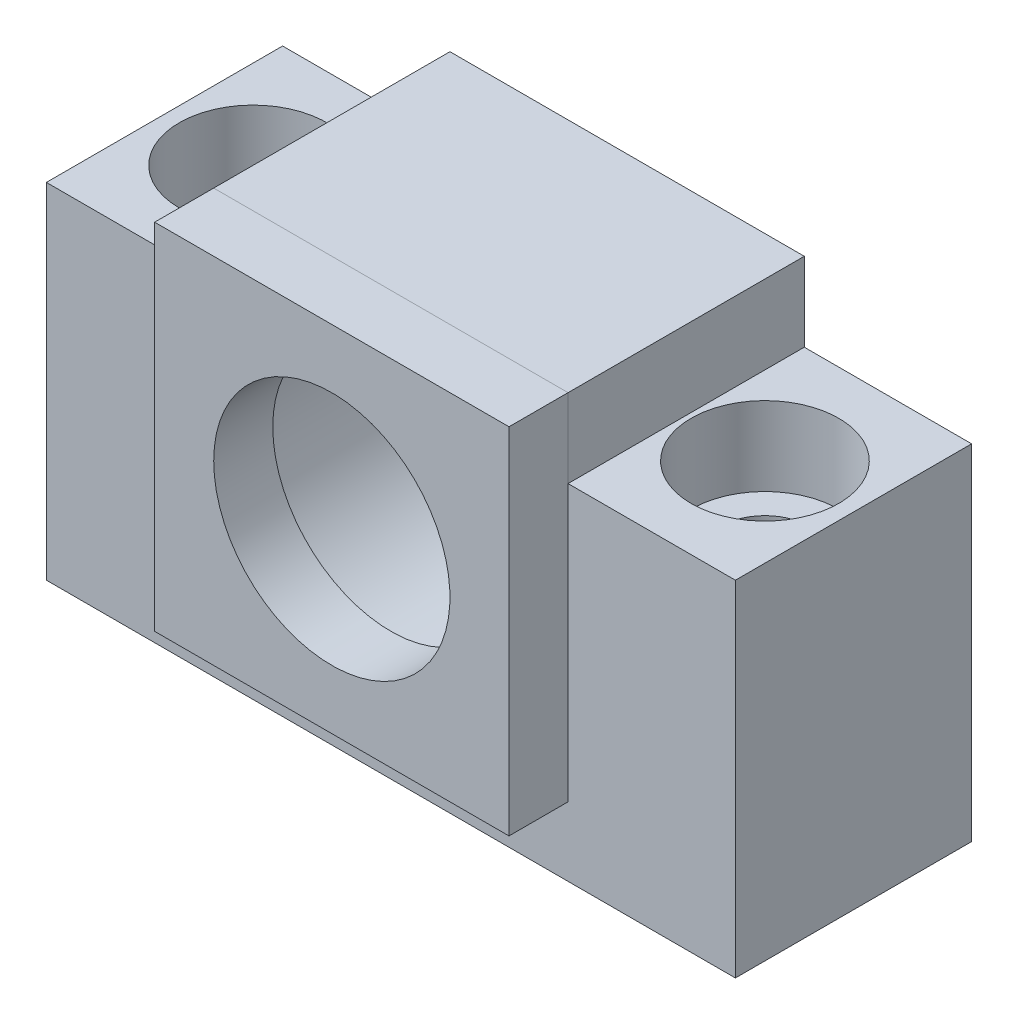
ISO-10303-21;
HEADER;
FILE_DESCRIPTION(('STEP AP214'),'2;1');
FILE_NAME('part.step','',(''),(''),'','','');
FILE_SCHEMA(('AUTOMOTIVE_DESIGN { 1 0 10303 214 1 1 1 1 }'));
ENDSEC;
DATA;
#1=APPLICATION_CONTEXT('core data for automotive mechanical design processes');
#2=APPLICATION_PROTOCOL_DEFINITION('international standard','automotive_design',2000,#1);
#3=PRODUCT_CONTEXT('',#1,'mechanical');
#4=PRODUCT('Part','Part','',(#3));
#5=PRODUCT_RELATED_PRODUCT_CATEGORY('part','',(#4));
#6=PRODUCT_DEFINITION_FORMATION('','',#4);
#7=PRODUCT_DEFINITION_CONTEXT('part definition',#1,'design');
#8=PRODUCT_DEFINITION('design','',#6,#7);
#9=PRODUCT_DEFINITION_SHAPE('','',#8);
#10=(LENGTH_UNIT() NAMED_UNIT(*) SI_UNIT(.MILLI.,.METRE.));
#11=(NAMED_UNIT(*) PLANE_ANGLE_UNIT() SI_UNIT($,.RADIAN.));
#12=(NAMED_UNIT(*) SI_UNIT($,.STERADIAN.) SOLID_ANGLE_UNIT());
#13=UNCERTAINTY_MEASURE_WITH_UNIT(LENGTH_MEASURE(1.E-05),#10,'distance_accuracy_value','');
#14=(GEOMETRIC_REPRESENTATION_CONTEXT(3) GLOBAL_UNCERTAINTY_ASSIGNED_CONTEXT((#13)) GLOBAL_UNIT_ASSIGNED_CONTEXT((#10,
#11,#12)) REPRESENTATION_CONTEXT('',''));
#15=CARTESIAN_POINT('',(0.,0.,0.));
#16=DIRECTION('',(0.,0.,1.));
#17=DIRECTION('',(1.,0.,0.));
#18=AXIS2_PLACEMENT_3D('',#15,#16,#17);
#19=CARTESIAN_POINT('',(17.,43.,30.));
#20=DIRECTION('',(1.,0.,0.));
#21=DIRECTION('',(0.,1.,0.));
#22=AXIS2_PLACEMENT_3D('',#19,#20,#21);
#23=PLANE('',#22);
#24=DIRECTION('',(0.,-1.,0.));
#25=VECTOR('',#24,1.);
#26=CARTESIAN_POINT('',(17.,43.,24.));
#27=LINE('',#26,#25);
#28=CARTESIAN_POINT('',(17.,43.,24.));
#29=VERTEX_POINT('',#28);
#30=CARTESIAN_POINT('',(17.,7.,24.));
#31=VERTEX_POINT('',#30);
#32=EDGE_CURVE('E106',#29,#31,#27,.T.);
#33=ORIENTED_EDGE('',*,*,#32,.T.);
#34=DIRECTION('',(0.,0.,-1.));
#35=VECTOR('',#34,1.);
#36=CARTESIAN_POINT('',(17.,7.,30.));
#37=LINE('',#36,#35);
#38=CARTESIAN_POINT('',(17.,7.,30.));
#39=VERTEX_POINT('',#38);
#40=EDGE_CURVE('E12',#39,#31,#37,.T.);
#41=ORIENTED_EDGE('',*,*,#40,.F.);
#42=DIRECTION('',(0.,-1.,0.));
#43=VECTOR('',#42,1.);
#44=CARTESIAN_POINT('',(17.,43.,30.));
#45=LINE('',#44,#43);
#46=CARTESIAN_POINT('',(17.,43.,30.));
#47=VERTEX_POINT('',#46);
#48=EDGE_CURVE('E94',#47,#39,#45,.T.);
#49=ORIENTED_EDGE('',*,*,#48,.F.);
#50=DIRECTION('',(0.,0.,-1.));
#51=VECTOR('',#50,1.);
#52=CARTESIAN_POINT('',(17.,43.,30.));
#53=LINE('',#52,#51);
#54=EDGE_CURVE('E102',#47,#29,#53,.T.);
#55=ORIENTED_EDGE('',*,*,#54,.T.);
#56=EDGE_LOOP('',(#33,#41,#49,#55));
#57=FACE_BOUND('',#56,.T.);
#58=ADVANCED_FACE('F43',(#57),#23,.F.);
#59=CARTESIAN_POINT('',(17.,7.,30.));
#60=DIRECTION('',(0.,1.,0.));
#61=DIRECTION('',(0.,0.,1.));
#62=AXIS2_PLACEMENT_3D('',#59,#60,#61);
#63=PLANE('',#62);
#64=DIRECTION('',(1.,0.,0.));
#65=VECTOR('',#64,1.);
#66=CARTESIAN_POINT('',(17.,7.,24.));
#67=LINE('',#66,#65);
#68=CARTESIAN_POINT('',(53.,7.,24.));
#69=VERTEX_POINT('',#68);
#70=EDGE_CURVE('E98',#31,#69,#67,.T.);
#71=ORIENTED_EDGE('',*,*,#70,.T.);
#72=DIRECTION('',(0.,0.,-1.));
#73=VECTOR('',#72,1.);
#74=CARTESIAN_POINT('',(53.,7.,30.));
#75=LINE('',#74,#73);
#76=CARTESIAN_POINT('',(53.,7.,30.));
#77=VERTEX_POINT('',#76);
#78=EDGE_CURVE('E51',#77,#69,#75,.T.);
#79=ORIENTED_EDGE('',*,*,#78,.F.);
#80=DIRECTION('',(1.,0.,0.));
#81=VECTOR('',#80,1.);
#82=CARTESIAN_POINT('',(17.,7.,30.));
#83=LINE('',#82,#81);
#84=EDGE_CURVE('E89',#39,#77,#83,.T.);
#85=ORIENTED_EDGE('',*,*,#84,.F.);
#86=ORIENTED_EDGE('',*,*,#40,.T.);
#87=EDGE_LOOP('',(#71,#79,#85,#86));
#88=FACE_BOUND('',#87,.T.);
#89=ADVANCED_FACE('F97',(#88),#63,.F.);
#90=CARTESIAN_POINT('',(53.,43.,30.));
#91=DIRECTION('',(-1.,0.,0.));
#92=DIRECTION('',(0.,0.,1.));
#93=AXIS2_PLACEMENT_3D('',#90,#91,#92);
#94=PLANE('',#93);
#95=DIRECTION('',(0.,1.,0.));
#96=VECTOR('',#95,1.);
#97=CARTESIAN_POINT('',(53.,43.,24.));
#98=LINE('',#97,#96);
#99=CARTESIAN_POINT('',(53.,43.,24.));
#100=VERTEX_POINT('',#99);
#101=EDGE_CURVE('E76',#69,#100,#98,.T.);
#102=ORIENTED_EDGE('',*,*,#101,.T.);
#103=DIRECTION('',(0.,0.,-1.));
#104=VECTOR('',#103,1.);
#105=CARTESIAN_POINT('',(53.,43.,30.));
#106=LINE('',#105,#104);
#107=CARTESIAN_POINT('',(53.,43.,30.));
#108=VERTEX_POINT('',#107);
#109=EDGE_CURVE('E99',#108,#100,#106,.T.);
#110=ORIENTED_EDGE('',*,*,#109,.F.);
#111=DIRECTION('',(0.,1.,0.));
#112=VECTOR('',#111,1.);
#113=CARTESIAN_POINT('',(53.,43.,30.));
#114=LINE('',#113,#112);
#115=EDGE_CURVE('E92',#77,#108,#114,.T.);
#116=ORIENTED_EDGE('',*,*,#115,.F.);
#117=ORIENTED_EDGE('',*,*,#78,.T.);
#118=EDGE_LOOP('',(#102,#110,#116,#117));
#119=FACE_BOUND('',#118,.T.);
#120=ADVANCED_FACE('F100',(#119),#94,.F.);
#121=CARTESIAN_POINT('',(17.,43.,30.));
#122=DIRECTION('',(0.,-1.,0.));
#123=DIRECTION('',(0.,0.,-1.));
#124=AXIS2_PLACEMENT_3D('',#121,#122,#123);
#125=PLANE('',#124);
#126=DIRECTION('',(-1.,0.,0.));
#127=VECTOR('',#126,1.);
#128=CARTESIAN_POINT('',(17.,43.,24.));
#129=LINE('',#128,#127);
#130=EDGE_CURVE('E82',#100,#29,#129,.T.);
#131=ORIENTED_EDGE('',*,*,#130,.T.);
#132=ORIENTED_EDGE('',*,*,#54,.F.);
#133=DIRECTION('',(-1.,0.,0.));
#134=VECTOR('',#133,1.);
#135=CARTESIAN_POINT('',(17.,43.,30.));
#136=LINE('',#135,#134);
#137=EDGE_CURVE('E59',#108,#47,#136,.T.);
#138=ORIENTED_EDGE('',*,*,#137,.F.);
#139=ORIENTED_EDGE('',*,*,#109,.T.);
#140=EDGE_LOOP('',(#131,#132,#138,#139));
#141=FACE_BOUND('',#140,.T.);
#142=ADVANCED_FACE('F114',(#141),#125,.F.);
#143=CARTESIAN_POINT('',(17.,7.,30.));
#144=DIRECTION('',(0.,0.,1.));
#145=DIRECTION('',(1.,0.,0.));
#146=AXIS2_PLACEMENT_3D('',#143,#144,#145);
#147=PLANE('',#146);
#148=CARTESIAN_POINT('',(35.,25.,30.));
#149=DIRECTION('',(0.,0.,-1.));
#150=DIRECTION('',(-1.,0.,0.));
#151=AXIS2_PLACEMENT_3D('',#148,#149,#150);
#152=CIRCLE('',#151,12.);
#153=CARTESIAN_POINT('',(23.,25.,30.));
#154=VERTEX_POINT('',#153);
#155=EDGE_CURVE('E109',#154,#154,#152,.T.);
#156=ORIENTED_EDGE('',*,*,#155,.T.);
#157=EDGE_LOOP('',(#156));
#158=FACE_BOUND('',#157,.T.);
#159=ORIENTED_EDGE('',*,*,#48,.T.);
#160=ORIENTED_EDGE('',*,*,#84,.T.);
#161=ORIENTED_EDGE('',*,*,#115,.T.);
#162=ORIENTED_EDGE('',*,*,#137,.T.);
#163=EDGE_LOOP('',(#159,#160,#161,#162));
#164=FACE_BOUND('',#163,.T.);
#165=ADVANCED_FACE('F90',(#158,#164),#147,.T.);
#166=CARTESIAN_POINT('',(17.,7.,24.));
#167=DIRECTION('',(0.,0.,1.));
#168=DIRECTION('',(1.,0.,0.));
#169=AXIS2_PLACEMENT_3D('',#166,#167,#168);
#170=PLANE('',#169);
#171=CARTESIAN_POINT('',(35.,25.,24.));
#172=DIRECTION('',(0.,0.,-1.));
#173=DIRECTION('',(-1.,0.,0.));
#174=AXIS2_PLACEMENT_3D('',#171,#172,#173);
#175=CIRCLE('',#174,12.);
#176=CARTESIAN_POINT('',(23.,25.,24.));
#177=VERTEX_POINT('',#176);
#178=EDGE_CURVE('E120',#177,#177,#175,.T.);
#179=ORIENTED_EDGE('',*,*,#178,.F.);
#180=EDGE_LOOP('',(#179));
#181=FACE_BOUND('',#180,.T.);
#182=ORIENTED_EDGE('',*,*,#32,.F.);
#183=ORIENTED_EDGE('',*,*,#130,.F.);
#184=ORIENTED_EDGE('',*,*,#101,.F.);
#185=ORIENTED_EDGE('',*,*,#70,.F.);
#186=EDGE_LOOP('',(#182,#183,#184,#185));
#187=FACE_BOUND('',#186,.T.);
#188=ADVANCED_FACE('F117',(#181,#187),#170,.F.);
#189=CARTESIAN_POINT('',(35.,25.,30.));
#190=DIRECTION('',(0.,0.,-1.));
#191=DIRECTION('',(-1.,0.,0.));
#192=AXIS2_PLACEMENT_3D('',#189,#190,#191);
#193=CYLINDRICAL_SURFACE('',#192,12.);
#194=ORIENTED_EDGE('',*,*,#155,.F.);
#195=EDGE_LOOP('',(#194));
#196=FACE_BOUND('',#195,.T.);
#197=ORIENTED_EDGE('',*,*,#178,.T.);
#198=EDGE_LOOP('',(#197));
#199=FACE_BOUND('',#198,.T.);
#200=ADVANCED_FACE('F127',(#196,#199),#193,.F.);
#201=CLOSED_SHELL('',(#58,#89,#120,#142,#165,#188,#200));
#202=MANIFOLD_SOLID_BREP('B2',#201);
#203=CARTESIAN_POINT('',(0.,0.,24.));
#204=DIRECTION('',(1.,0.,0.));
#205=DIRECTION('',(0.,0.,-1.));
#206=AXIS2_PLACEMENT_3D('',#203,#204,#205);
#207=PLANE('',#206);
#208=DIRECTION('',(0.,-1.,0.));
#209=VECTOR('',#208,1.);
#210=CARTESIAN_POINT('',(0.,0.,24.));
#211=LINE('',#210,#209);
#212=CARTESIAN_POINT('',(0.,35.,24.));
#213=VERTEX_POINT('',#212);
#214=CARTESIAN_POINT('',(0.,0.,24.));
#215=VERTEX_POINT('',#214);
#216=EDGE_CURVE('E272',#213,#215,#211,.T.);
#217=ORIENTED_EDGE('',*,*,#216,.F.);
#218=DIRECTION('',(0.,0.,1.));
#219=VECTOR('',#218,1.);
#220=CARTESIAN_POINT('',(0.,35.,0.));
#221=LINE('',#220,#219);
#222=CARTESIAN_POINT('',(0.,35.,0.));
#223=VERTEX_POINT('',#222);
#224=EDGE_CURVE('E313',#223,#213,#221,.T.);
#225=ORIENTED_EDGE('',*,*,#224,.F.);
#226=DIRECTION('',(0.,-1.,0.));
#227=VECTOR('',#226,1.);
#228=CARTESIAN_POINT('',(0.,0.,0.));
#229=LINE('',#228,#227);
#230=CARTESIAN_POINT('',(0.,0.,0.));
#231=VERTEX_POINT('',#230);
#232=EDGE_CURVE('E295',#223,#231,#229,.T.);
#233=ORIENTED_EDGE('',*,*,#232,.T.);
#234=DIRECTION('',(0.,0.,-1.));
#235=VECTOR('',#234,1.);
#236=CARTESIAN_POINT('',(0.,0.,24.));
#237=LINE('',#236,#235);
#238=EDGE_CURVE('E41',#215,#231,#237,.T.);
#239=ORIENTED_EDGE('',*,*,#238,.F.);
#240=EDGE_LOOP('',(#217,#225,#233,#239));
#241=FACE_BOUND('',#240,.T.);
#242=ADVANCED_FACE('F188',(#241),#207,.F.);
#243=CARTESIAN_POINT('',(0.,0.,24.));
#244=DIRECTION('',(0.,1.,0.));
#245=DIRECTION('',(0.,0.,1.));
#246=AXIS2_PLACEMENT_3D('',#243,#244,#245);
#247=PLANE('',#246);
#248=CARTESIAN_POINT('',(61.,0.,12.));
#249=DIRECTION('',(0.,1.,0.));
#250=DIRECTION('',(0.,0.,1.));
#251=AXIS2_PLACEMENT_3D('',#248,#249,#250);
#252=CIRCLE('',#251,4.49999999999999);
#253=CARTESIAN_POINT('',(61.,0.,16.5));
#254=VERTEX_POINT('',#253);
#255=EDGE_CURVE('E354',#254,#254,#252,.T.);
#256=ORIENTED_EDGE('',*,*,#255,.T.);
#257=EDGE_LOOP('',(#256));
#258=FACE_BOUND('',#257,.T.);
#259=CARTESIAN_POINT('',(9.00000000000001,0.,12.));
#260=DIRECTION('',(0.,1.,0.));
#261=DIRECTION('',(0.,0.,1.));
#262=AXIS2_PLACEMENT_3D('',#259,#260,#261);
#263=CIRCLE('',#262,4.49999999999999);
#264=CARTESIAN_POINT('',(9.00000000000001,0.,16.5));
#265=VERTEX_POINT('',#264);
#266=EDGE_CURVE('E340',#265,#265,#263,.T.);
#267=ORIENTED_EDGE('',*,*,#266,.T.);
#268=EDGE_LOOP('',(#267));
#269=FACE_BOUND('',#268,.T.);
#270=DIRECTION('',(1.,0.,0.));
#271=VECTOR('',#270,1.);
#272=CARTESIAN_POINT('',(0.,0.,0.));
#273=LINE('',#272,#271);
#274=CARTESIAN_POINT('',(70.,0.,0.));
#275=VERTEX_POINT('',#274);
#276=EDGE_CURVE('E278',#231,#275,#273,.T.);
#277=ORIENTED_EDGE('',*,*,#276,.T.);
#278=DIRECTION('',(0.,0.,-1.));
#279=VECTOR('',#278,1.);
#280=CARTESIAN_POINT('',(70.,0.,24.));
#281=LINE('',#280,#279);
#282=CARTESIAN_POINT('',(70.,0.,24.));
#283=VERTEX_POINT('',#282);
#284=EDGE_CURVE('E195',#283,#275,#281,.T.);
#285=ORIENTED_EDGE('',*,*,#284,.F.);
#286=DIRECTION('',(1.,0.,0.));
#287=VECTOR('',#286,1.);
#288=CARTESIAN_POINT('',(0.,0.,24.));
#289=LINE('',#288,#287);
#290=EDGE_CURVE('E275',#215,#283,#289,.T.);
#291=ORIENTED_EDGE('',*,*,#290,.F.);
#292=ORIENTED_EDGE('',*,*,#238,.T.);
#293=EDGE_LOOP('',(#277,#285,#291,#292));
#294=FACE_BOUND('',#293,.T.);
#295=ADVANCED_FACE('F299',(#258,#269,#294),#247,.F.);
#296=CARTESIAN_POINT('',(70.,0.,24.));
#297=DIRECTION('',(-1.,0.,0.));
#298=DIRECTION('',(0.,0.,1.));
#299=AXIS2_PLACEMENT_3D('',#296,#297,#298);
#300=PLANE('',#299);
#301=DIRECTION('',(0.,1.,0.));
#302=VECTOR('',#301,1.);
#303=CARTESIAN_POINT('',(70.,0.,0.));
#304=LINE('',#303,#302);
#305=CARTESIAN_POINT('',(70.,35.,0.));
#306=VERTEX_POINT('',#305);
#307=EDGE_CURVE('E273',#275,#306,#304,.T.);
#308=ORIENTED_EDGE('',*,*,#307,.T.);
#309=DIRECTION('',(0.,0.,1.));
#310=VECTOR('',#309,1.);
#311=CARTESIAN_POINT('',(70.,35.,0.));
#312=LINE('',#311,#310);
#313=CARTESIAN_POINT('',(70.,35.,24.));
#314=VERTEX_POINT('',#313);
#315=EDGE_CURVE('E305',#306,#314,#312,.T.);
#316=ORIENTED_EDGE('',*,*,#315,.T.);
#317=DIRECTION('',(0.,1.,0.));
#318=VECTOR('',#317,1.);
#319=CARTESIAN_POINT('',(70.,0.,24.));
#320=LINE('',#319,#318);
#321=EDGE_CURVE('E286',#283,#314,#320,.T.);
#322=ORIENTED_EDGE('',*,*,#321,.F.);
#323=ORIENTED_EDGE('',*,*,#284,.T.);
#324=EDGE_LOOP('',(#308,#316,#322,#323));
#325=FACE_BOUND('',#324,.T.);
#326=ADVANCED_FACE('F304',(#325),#300,.F.);
#327=CARTESIAN_POINT('',(0.,43.,24.));
#328=DIRECTION('',(0.,-1.,0.));
#329=DIRECTION('',(0.,0.,-1.));
#330=AXIS2_PLACEMENT_3D('',#327,#328,#329);
#331=PLANE('',#330);
#332=DIRECTION('',(-1.,0.,0.));
#333=VECTOR('',#332,1.);
#334=CARTESIAN_POINT('',(0.,43.,24.));
#335=LINE('',#334,#333);
#336=CARTESIAN_POINT('',(53.,43.,24.));
#337=VERTEX_POINT('',#336);
#338=CARTESIAN_POINT('',(17.,43.,24.));
#339=VERTEX_POINT('',#338);
#340=EDGE_CURVE('E268',#337,#339,#335,.T.);
#341=ORIENTED_EDGE('',*,*,#340,.F.);
#342=DIRECTION('',(0.,0.,1.));
#343=VECTOR('',#342,1.);
#344=CARTESIAN_POINT('',(53.,43.,0.));
#345=LINE('',#344,#343);
#346=CARTESIAN_POINT('',(53.,43.,0.));
#347=VERTEX_POINT('',#346);
#348=EDGE_CURVE('E256',#347,#337,#345,.T.);
#349=ORIENTED_EDGE('',*,*,#348,.F.);
#350=DIRECTION('',(-1.,0.,0.));
#351=VECTOR('',#350,1.);
#352=CARTESIAN_POINT('',(0.,43.,0.));
#353=LINE('',#352,#351);
#354=CARTESIAN_POINT('',(17.,43.,0.));
#355=VERTEX_POINT('',#354);
#356=EDGE_CURVE('E267',#347,#355,#353,.T.);
#357=ORIENTED_EDGE('',*,*,#356,.T.);
#358=DIRECTION('',(0.,0.,1.));
#359=VECTOR('',#358,1.);
#360=CARTESIAN_POINT('',(17.,43.,0.));
#361=LINE('',#360,#359);
#362=EDGE_CURVE('E296',#355,#339,#361,.T.);
#363=ORIENTED_EDGE('',*,*,#362,.T.);
#364=EDGE_LOOP('',(#341,#349,#357,#363));
#365=FACE_BOUND('',#364,.T.);
#366=ADVANCED_FACE('F265',(#365),#331,.F.);
#367=CARTESIAN_POINT('',(0.,43.,24.));
#368=DIRECTION('',(0.,0.,-1.));
#369=DIRECTION('',(-1.,0.,0.));
#370=AXIS2_PLACEMENT_3D('',#367,#368,#369);
#371=PLANE('',#370);
#372=CARTESIAN_POINT('',(35.,25.,24.));
#373=DIRECTION('',(0.,0.,1.));
#374=DIRECTION('',(1.,0.,0.));
#375=AXIS2_PLACEMENT_3D('',#372,#373,#374);
#376=CIRCLE('',#375,15.);
#377=CARTESIAN_POINT('',(50.,25.,24.));
#378=VERTEX_POINT('',#377);
#379=EDGE_CURVE('E331',#378,#378,#376,.T.);
#380=ORIENTED_EDGE('',*,*,#379,.F.);
#381=EDGE_LOOP('',(#380));
#382=FACE_BOUND('',#381,.T.);
#383=ORIENTED_EDGE('',*,*,#321,.T.);
#384=DIRECTION('',(1.,0.,0.));
#385=VECTOR('',#384,1.);
#386=CARTESIAN_POINT('',(70.,35.,24.));
#387=LINE('',#386,#385);
#388=CARTESIAN_POINT('',(53.,35.,24.));
#389=VERTEX_POINT('',#388);
#390=EDGE_CURVE('E261',#389,#314,#387,.T.);
#391=ORIENTED_EDGE('',*,*,#390,.F.);
#392=DIRECTION('',(0.,-1.,0.));
#393=VECTOR('',#392,1.);
#394=CARTESIAN_POINT('',(53.,43.,24.));
#395=LINE('',#394,#393);
#396=EDGE_CURVE('E327',#337,#389,#395,.T.);
#397=ORIENTED_EDGE('',*,*,#396,.F.);
#398=ORIENTED_EDGE('',*,*,#340,.T.);
#399=DIRECTION('',(0.,1.,0.));
#400=VECTOR('',#399,1.);
#401=CARTESIAN_POINT('',(17.,43.,24.));
#402=LINE('',#401,#400);
#403=CARTESIAN_POINT('',(17.,35.,24.));
#404=VERTEX_POINT('',#403);
#405=EDGE_CURVE('E318',#404,#339,#402,.T.);
#406=ORIENTED_EDGE('',*,*,#405,.F.);
#407=DIRECTION('',(1.,0.,0.));
#408=VECTOR('',#407,1.);
#409=CARTESIAN_POINT('',(0.,35.,24.));
#410=LINE('',#409,#408);
#411=EDGE_CURVE('E306',#213,#404,#410,.T.);
#412=ORIENTED_EDGE('',*,*,#411,.F.);
#413=ORIENTED_EDGE('',*,*,#216,.T.);
#414=ORIENTED_EDGE('',*,*,#290,.T.);
#415=EDGE_LOOP('',(#383,#391,#397,#398,#406,#412,#413,#414));
#416=FACE_BOUND('',#415,.T.);
#417=ADVANCED_FACE('F309',(#382,#416),#371,.F.);
#418=CARTESIAN_POINT('',(0.,43.,0.));
#419=DIRECTION('',(0.,0.,-1.));
#420=DIRECTION('',(-1.,0.,0.));
#421=AXIS2_PLACEMENT_3D('',#418,#419,#420);
#422=PLANE('',#421);
#423=CARTESIAN_POINT('',(35.,25.,0.));
#424=DIRECTION('',(0.,0.,1.));
#425=DIRECTION('',(1.,0.,0.));
#426=AXIS2_PLACEMENT_3D('',#423,#424,#425);
#427=CIRCLE('',#426,12.);
#428=CARTESIAN_POINT('',(47.,25.,0.));
#429=VERTEX_POINT('',#428);
#430=EDGE_CURVE('E334',#429,#429,#427,.T.);
#431=ORIENTED_EDGE('',*,*,#430,.T.);
#432=EDGE_LOOP('',(#431));
#433=FACE_BOUND('',#432,.T.);
#434=DIRECTION('',(1.,0.,0.));
#435=VECTOR('',#434,1.);
#436=CARTESIAN_POINT('',(70.,35.,0.));
#437=LINE('',#436,#435);
#438=CARTESIAN_POINT('',(53.,35.,0.));
#439=VERTEX_POINT('',#438);
#440=EDGE_CURVE('E202',#439,#306,#437,.T.);
#441=ORIENTED_EDGE('',*,*,#440,.T.);
#442=ORIENTED_EDGE('',*,*,#307,.F.);
#443=ORIENTED_EDGE('',*,*,#276,.F.);
#444=ORIENTED_EDGE('',*,*,#232,.F.);
#445=DIRECTION('',(1.,0.,0.));
#446=VECTOR('',#445,1.);
#447=CARTESIAN_POINT('',(0.,35.,0.));
#448=LINE('',#447,#446);
#449=CARTESIAN_POINT('',(17.,35.,0.));
#450=VERTEX_POINT('',#449);
#451=EDGE_CURVE('E320',#223,#450,#448,.T.);
#452=ORIENTED_EDGE('',*,*,#451,.T.);
#453=DIRECTION('',(0.,1.,0.));
#454=VECTOR('',#453,1.);
#455=CARTESIAN_POINT('',(17.,43.,0.));
#456=LINE('',#455,#454);
#457=EDGE_CURVE('E210',#450,#355,#456,.T.);
#458=ORIENTED_EDGE('',*,*,#457,.T.);
#459=ORIENTED_EDGE('',*,*,#356,.F.);
#460=DIRECTION('',(0.,-1.,0.));
#461=VECTOR('',#460,1.);
#462=CARTESIAN_POINT('',(53.,43.,0.));
#463=LINE('',#462,#461);
#464=EDGE_CURVE('E252',#347,#439,#463,.T.);
#465=ORIENTED_EDGE('',*,*,#464,.T.);
#466=EDGE_LOOP('',(#441,#442,#443,#444,#452,#458,#459,#465));
#467=FACE_BOUND('',#466,.T.);
#468=ADVANCED_FACE('F270',(#433,#467),#422,.T.);
#469=CARTESIAN_POINT('',(17.,43.,0.));
#470=DIRECTION('',(1.,0.,0.));
#471=DIRECTION('',(0.,1.,0.));
#472=AXIS2_PLACEMENT_3D('',#469,#470,#471);
#473=PLANE('',#472);
#474=ORIENTED_EDGE('',*,*,#405,.T.);
#475=ORIENTED_EDGE('',*,*,#362,.F.);
#476=ORIENTED_EDGE('',*,*,#457,.F.);
#477=DIRECTION('',(0.,0.,1.));
#478=VECTOR('',#477,1.);
#479=CARTESIAN_POINT('',(17.,35.,0.));
#480=LINE('',#479,#478);
#481=EDGE_CURVE('E315',#450,#404,#480,.T.);
#482=ORIENTED_EDGE('',*,*,#481,.T.);
#483=EDGE_LOOP('',(#474,#475,#476,#482));
#484=FACE_BOUND('',#483,.T.);
#485=ADVANCED_FACE('F379',(#484),#473,.F.);
#486=CARTESIAN_POINT('',(0.,35.,0.));
#487=DIRECTION('',(0.,-1.,0.));
#488=DIRECTION('',(0.,0.,-1.));
#489=AXIS2_PLACEMENT_3D('',#486,#487,#488);
#490=PLANE('',#489);
#491=CARTESIAN_POINT('',(9.00000000000001,35.,12.));
#492=DIRECTION('',(0.,1.,0.));
#493=DIRECTION('',(0.,0.,1.));
#494=AXIS2_PLACEMENT_3D('',#491,#492,#493);
#495=CIRCLE('',#494,7.5);
#496=CARTESIAN_POINT('',(9.00000000000001,35.,19.5));
#497=VERTEX_POINT('',#496);
#498=EDGE_CURVE('E351',#497,#497,#495,.T.);
#499=ORIENTED_EDGE('',*,*,#498,.F.);
#500=EDGE_LOOP('',(#499));
#501=FACE_BOUND('',#500,.T.);
#502=ORIENTED_EDGE('',*,*,#411,.T.);
#503=ORIENTED_EDGE('',*,*,#481,.F.);
#504=ORIENTED_EDGE('',*,*,#451,.F.);
#505=ORIENTED_EDGE('',*,*,#224,.T.);
#506=EDGE_LOOP('',(#502,#503,#504,#505));
#507=FACE_BOUND('',#506,.T.);
#508=ADVANCED_FACE('F371',(#501,#507),#490,.F.);
#509=CARTESIAN_POINT('',(70.,35.,0.));
#510=DIRECTION('',(0.,-1.,0.));
#511=DIRECTION('',(0.,0.,-1.));
#512=AXIS2_PLACEMENT_3D('',#509,#510,#511);
#513=PLANE('',#512);
#514=CARTESIAN_POINT('',(61.,35.,12.));
#515=DIRECTION('',(0.,1.,0.));
#516=DIRECTION('',(0.,0.,1.));
#517=AXIS2_PLACEMENT_3D('',#514,#515,#516);
#518=CIRCLE('',#517,7.49999999999999);
#519=CARTESIAN_POINT('',(61.,35.,19.5));
#520=VERTEX_POINT('',#519);
#521=EDGE_CURVE('E363',#520,#520,#518,.T.);
#522=ORIENTED_EDGE('',*,*,#521,.F.);
#523=EDGE_LOOP('',(#522));
#524=FACE_BOUND('',#523,.T.);
#525=ORIENTED_EDGE('',*,*,#390,.T.);
#526=ORIENTED_EDGE('',*,*,#315,.F.);
#527=ORIENTED_EDGE('',*,*,#440,.F.);
#528=DIRECTION('',(0.,0.,1.));
#529=VECTOR('',#528,1.);
#530=CARTESIAN_POINT('',(53.,35.,0.));
#531=LINE('',#530,#529);
#532=EDGE_CURVE('E258',#439,#389,#531,.T.);
#533=ORIENTED_EDGE('',*,*,#532,.T.);
#534=EDGE_LOOP('',(#525,#526,#527,#533));
#535=FACE_BOUND('',#534,.T.);
#536=ADVANCED_FACE('F369',(#524,#535),#513,.F.);
#537=CARTESIAN_POINT('',(53.,43.,0.));
#538=DIRECTION('',(-1.,0.,0.));
#539=DIRECTION('',(0.,0.,1.));
#540=AXIS2_PLACEMENT_3D('',#537,#538,#539);
#541=PLANE('',#540);
#542=ORIENTED_EDGE('',*,*,#396,.T.);
#543=ORIENTED_EDGE('',*,*,#532,.F.);
#544=ORIENTED_EDGE('',*,*,#464,.F.);
#545=ORIENTED_EDGE('',*,*,#348,.T.);
#546=EDGE_LOOP('',(#542,#543,#544,#545));
#547=FACE_BOUND('',#546,.T.);
#548=ADVANCED_FACE('F255',(#547),#541,.F.);
#549=CARTESIAN_POINT('',(35.,25.,6.));
#550=DIRECTION('',(0.,0.,1.));
#551=DIRECTION('',(1.,0.,0.));
#552=AXIS2_PLACEMENT_3D('',#549,#550,#551);
#553=CYLINDRICAL_SURFACE('',#552,15.);
#554=CARTESIAN_POINT('',(35.,25.,6.));
#555=DIRECTION('',(0.,0.,1.));
#556=DIRECTION('',(1.,0.,0.));
#557=AXIS2_PLACEMENT_3D('',#554,#555,#556);
#558=CIRCLE('',#557,15.);
#559=CARTESIAN_POINT('',(50.,25.,6.));
#560=VERTEX_POINT('',#559);
#561=EDGE_CURVE('E329',#560,#560,#558,.T.);
#562=ORIENTED_EDGE('',*,*,#561,.F.);
#563=EDGE_LOOP('',(#562));
#564=FACE_BOUND('',#563,.T.);
#565=ORIENTED_EDGE('',*,*,#379,.T.);
#566=EDGE_LOOP('',(#565));
#567=FACE_BOUND('',#566,.T.);
#568=ADVANCED_FACE('F377',(#564,#567),#553,.F.);
#569=CARTESIAN_POINT('',(35.,25.,6.));
#570=DIRECTION('',(0.,0.,1.));
#571=DIRECTION('',(1.,0.,0.));
#572=AXIS2_PLACEMENT_3D('',#569,#570,#571);
#573=PLANE('',#572);
#574=CARTESIAN_POINT('',(35.,25.,6.));
#575=DIRECTION('',(0.,0.,1.));
#576=DIRECTION('',(1.,0.,0.));
#577=AXIS2_PLACEMENT_3D('',#574,#575,#576);
#578=CIRCLE('',#577,12.);
#579=CARTESIAN_POINT('',(47.,25.,6.));
#580=VERTEX_POINT('',#579);
#581=EDGE_CURVE('E337',#580,#580,#578,.T.);
#582=ORIENTED_EDGE('',*,*,#581,.F.);
#583=EDGE_LOOP('',(#582));
#584=FACE_BOUND('',#583,.T.);
#585=ORIENTED_EDGE('',*,*,#561,.T.);
#586=EDGE_LOOP('',(#585));
#587=FACE_BOUND('',#586,.T.);
#588=ADVANCED_FACE('F432',(#584,#587),#573,.T.);
#589=CARTESIAN_POINT('',(35.,25.,0.));
#590=DIRECTION('',(0.,0.,1.));
#591=DIRECTION('',(1.,0.,0.));
#592=AXIS2_PLACEMENT_3D('',#589,#590,#591);
#593=CYLINDRICAL_SURFACE('',#592,12.);
#594=ORIENTED_EDGE('',*,*,#430,.F.);
#595=EDGE_LOOP('',(#594));
#596=FACE_BOUND('',#595,.T.);
#597=ORIENTED_EDGE('',*,*,#581,.T.);
#598=EDGE_LOOP('',(#597));
#599=FACE_BOUND('',#598,.T.);
#600=ADVANCED_FACE('F437',(#596,#599),#593,.F.);
#601=CARTESIAN_POINT('',(9.00000000000001,35.,12.));
#602=DIRECTION('',(0.,1.,0.));
#603=DIRECTION('',(0.,0.,1.));
#604=AXIS2_PLACEMENT_3D('',#601,#602,#603);
#605=CYLINDRICAL_SURFACE('',#604,4.5);
#606=ORIENTED_EDGE('',*,*,#266,.F.);
#607=EDGE_LOOP('',(#606));
#608=FACE_BOUND('',#607,.T.);
#609=CARTESIAN_POINT('',(9.00000000000001,27.,12.));
#610=DIRECTION('',(0.,1.,0.));
#611=DIRECTION('',(0.,0.,1.));
#612=AXIS2_PLACEMENT_3D('',#609,#610,#611);
#613=CIRCLE('',#612,4.5);
#614=CARTESIAN_POINT('',(9.00000000000001,27.,16.5));
#615=VERTEX_POINT('',#614);
#616=EDGE_CURVE('E345',#615,#615,#613,.T.);
#617=ORIENTED_EDGE('',*,*,#616,.T.);
#618=EDGE_LOOP('',(#617));
#619=FACE_BOUND('',#618,.T.);
#620=ADVANCED_FACE('F446',(#608,#619),#605,.F.);
#621=CARTESIAN_POINT('',(13.5,27.,12.));
#622=DIRECTION('',(0.,-1.,0.));
#623=DIRECTION('',(0.,0.,-1.));
#624=AXIS2_PLACEMENT_3D('',#621,#622,#623);
#625=PLANE('',#624);
#626=ORIENTED_EDGE('',*,*,#616,.F.);
#627=EDGE_LOOP('',(#626));
#628=FACE_BOUND('',#627,.T.);
#629=CARTESIAN_POINT('',(9.00000000000001,27.,12.));
#630=DIRECTION('',(0.,1.,0.));
#631=DIRECTION('',(0.,0.,1.));
#632=AXIS2_PLACEMENT_3D('',#629,#630,#631);
#633=CIRCLE('',#632,7.5);
#634=CARTESIAN_POINT('',(9.00000000000001,27.,19.5));
#635=VERTEX_POINT('',#634);
#636=EDGE_CURVE('E348',#635,#635,#633,.T.);
#637=ORIENTED_EDGE('',*,*,#636,.T.);
#638=EDGE_LOOP('',(#637));
#639=FACE_BOUND('',#638,.T.);
#640=ADVANCED_FACE('F473',(#628,#639),#625,.F.);
#641=CARTESIAN_POINT('',(9.00000000000001,35.,12.));
#642=DIRECTION('',(0.,1.,0.));
#643=DIRECTION('',(0.,0.,1.));
#644=AXIS2_PLACEMENT_3D('',#641,#642,#643);
#645=CYLINDRICAL_SURFACE('',#644,7.5);
#646=ORIENTED_EDGE('',*,*,#636,.F.);
#647=EDGE_LOOP('',(#646));
#648=FACE_BOUND('',#647,.T.);
#649=ORIENTED_EDGE('',*,*,#498,.T.);
#650=EDGE_LOOP('',(#649));
#651=FACE_BOUND('',#650,.T.);
#652=ADVANCED_FACE('F483',(#648,#651),#645,.F.);
#653=CARTESIAN_POINT('',(61.,35.,12.));
#654=DIRECTION('',(0.,1.,0.));
#655=DIRECTION('',(0.,0.,1.));
#656=AXIS2_PLACEMENT_3D('',#653,#654,#655);
#657=CYLINDRICAL_SURFACE('',#656,4.5);
#658=ORIENTED_EDGE('',*,*,#255,.F.);
#659=EDGE_LOOP('',(#658));
#660=FACE_BOUND('',#659,.T.);
#661=CARTESIAN_POINT('',(61.,27.,12.));
#662=DIRECTION('',(0.,1.,0.));
#663=DIRECTION('',(0.,0.,1.));
#664=AXIS2_PLACEMENT_3D('',#661,#662,#663);
#665=CIRCLE('',#664,4.5);
#666=CARTESIAN_POINT('',(61.,27.,16.5));
#667=VERTEX_POINT('',#666);
#668=EDGE_CURVE('E357',#667,#667,#665,.T.);
#669=ORIENTED_EDGE('',*,*,#668,.T.);
#670=EDGE_LOOP('',(#669));
#671=FACE_BOUND('',#670,.T.);
#672=ADVANCED_FACE('F493',(#660,#671),#657,.F.);
#673=CARTESIAN_POINT('',(65.5,27.,12.));
#674=DIRECTION('',(0.,-1.,0.));
#675=DIRECTION('',(0.,0.,-1.));
#676=AXIS2_PLACEMENT_3D('',#673,#674,#675);
#677=PLANE('',#676);
#678=ORIENTED_EDGE('',*,*,#668,.F.);
#679=EDGE_LOOP('',(#678));
#680=FACE_BOUND('',#679,.T.);
#681=CARTESIAN_POINT('',(61.,27.,12.));
#682=DIRECTION('',(0.,1.,0.));
#683=DIRECTION('',(0.,0.,1.));
#684=AXIS2_PLACEMENT_3D('',#681,#682,#683);
#685=CIRCLE('',#684,7.49999999999999);
#686=CARTESIAN_POINT('',(61.,27.,19.5));
#687=VERTEX_POINT('',#686);
#688=EDGE_CURVE('E360',#687,#687,#685,.T.);
#689=ORIENTED_EDGE('',*,*,#688,.T.);
#690=EDGE_LOOP('',(#689));
#691=FACE_BOUND('',#690,.T.);
#692=ADVANCED_FACE('F503',(#680,#691),#677,.F.);
#693=CARTESIAN_POINT('',(61.,35.,12.));
#694=DIRECTION('',(0.,1.,0.));
#695=DIRECTION('',(0.,0.,1.));
#696=AXIS2_PLACEMENT_3D('',#693,#694,#695);
#697=CYLINDRICAL_SURFACE('',#696,7.49999999999999);
#698=ORIENTED_EDGE('',*,*,#688,.F.);
#699=EDGE_LOOP('',(#698));
#700=FACE_BOUND('',#699,.T.);
#701=ORIENTED_EDGE('',*,*,#521,.T.);
#702=EDGE_LOOP('',(#701));
#703=FACE_BOUND('',#702,.T.);
#704=ADVANCED_FACE('F367',(#700,#703),#697,.F.);
#705=CLOSED_SHELL('',(#242,#295,#326,#366,#417,#468,#485,#508,#536,#548,#568,#588,#600,#620,
#640,#652,#672,#692,#704));
#706=MANIFOLD_SOLID_BREP('B6',#705);
#707=ADVANCED_BREP_SHAPE_REPRESENTATION('',(#18,#202,#706),#14);
#708=SHAPE_DEFINITION_REPRESENTATION(#9,#707);
ENDSEC;
END-ISO-10303-21;
